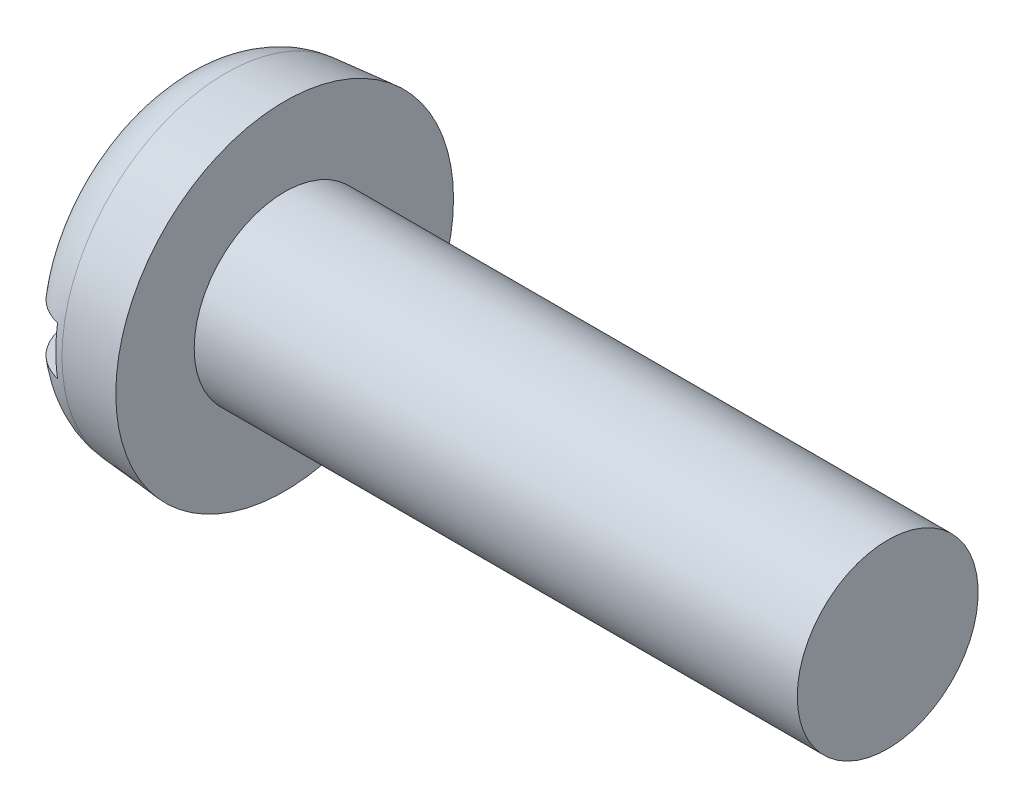
ISO-10303-21;
HEADER;
FILE_DESCRIPTION(('STEP AP214'),'2;1');
FILE_NAME('part.step','',(''),(''),'','','');
FILE_SCHEMA(('AUTOMOTIVE_DESIGN { 1 0 10303 214 1 1 1 1 }'));
ENDSEC;
DATA;
#1=APPLICATION_CONTEXT('core data for automotive mechanical design processes');
#2=APPLICATION_PROTOCOL_DEFINITION('international standard','automotive_design',2000,#1);
#3=PRODUCT_CONTEXT('',#1,'mechanical');
#4=PRODUCT('Part','Part','',(#3));
#5=PRODUCT_RELATED_PRODUCT_CATEGORY('part','',(#4));
#6=PRODUCT_DEFINITION_FORMATION('','',#4);
#7=PRODUCT_DEFINITION_CONTEXT('part definition',#1,'design');
#8=PRODUCT_DEFINITION('design','',#6,#7);
#9=PRODUCT_DEFINITION_SHAPE('','',#8);
#10=(LENGTH_UNIT() NAMED_UNIT(*) SI_UNIT(.MILLI.,.METRE.));
#11=(NAMED_UNIT(*) PLANE_ANGLE_UNIT() SI_UNIT($,.RADIAN.));
#12=(NAMED_UNIT(*) SI_UNIT($,.STERADIAN.) SOLID_ANGLE_UNIT());
#13=UNCERTAINTY_MEASURE_WITH_UNIT(LENGTH_MEASURE(1.E-05),#10,'distance_accuracy_value','');
#14=(GEOMETRIC_REPRESENTATION_CONTEXT(3) GLOBAL_UNCERTAINTY_ASSIGNED_CONTEXT((#13)) GLOBAL_UNIT_ASSIGNED_CONTEXT((#10,
#11,#12)) REPRESENTATION_CONTEXT('',''));
#15=CARTESIAN_POINT('',(0.,0.,0.));
#16=DIRECTION('',(0.,0.,1.));
#17=DIRECTION('',(1.,0.,0.));
#18=AXIS2_PLACEMENT_3D('',#15,#16,#17);
#19=CARTESIAN_POINT('',(0.,0.,0.));
#20=DIRECTION('',(-1.,0.,0.));
#21=DIRECTION('',(0.,0.,1.));
#22=AXIS2_PLACEMENT_3D('',#19,#20,#21);
#23=PLANE('',#22);
#24=DIRECTION('',(0.,0.,-1.));
#25=VECTOR('',#24,1.);
#26=CARTESIAN_POINT('',(0.,0.4,2.8));
#27=LINE('',#26,#25);
#28=CARTESIAN_POINT('',(0.,0.4,1.77326763142532));
#29=VERTEX_POINT('',#28);
#30=CARTESIAN_POINT('',(0.,0.4,-1.77326763142532));
#31=VERTEX_POINT('',#30);
#32=EDGE_CURVE('E87',#29,#31,#27,.T.);
#33=ORIENTED_EDGE('',*,*,#32,.F.);
#34=CARTESIAN_POINT('',(0.,0.,0.));
#35=DIRECTION('',(-1.,0.,0.));
#36=DIRECTION('',(0.,0.,1.));
#37=AXIS2_PLACEMENT_3D('',#34,#35,#36);
#38=CIRCLE('',#37,1.81782234903766);
#39=EDGE_CURVE('E93',#29,#31,#38,.T.);
#40=ORIENTED_EDGE('',*,*,#39,.T.);
#41=EDGE_LOOP('',(#33,#40));
#42=FACE_BOUND('',#41,.T.);
#43=ADVANCED_FACE('F34',(#42),#23,.T.);
#44=CARTESIAN_POINT('',(-25.4,0.,0.));
#45=DIRECTION('',(-1.,0.,0.));
#46=DIRECTION('',(0.,0.,1.));
#47=AXIS2_PLACEMENT_3D('',#44,#45,#46);
#48=CYLINDRICAL_SURFACE('',#47,1.5);
#49=CARTESIAN_POINT('',(11.8,0.,0.));
#50=DIRECTION('',(-1.,0.,0.));
#51=DIRECTION('',(0.,0.,1.));
#52=AXIS2_PLACEMENT_3D('',#49,#50,#51);
#53=CIRCLE('',#52,1.5);
#54=CARTESIAN_POINT('',(11.8,0.,1.5));
#55=VERTEX_POINT('',#54);
#56=EDGE_CURVE('E94',#55,#55,#53,.T.);
#57=ORIENTED_EDGE('',*,*,#56,.T.);
#58=EDGE_LOOP('',(#57));
#59=FACE_BOUND('',#58,.T.);
#60=CARTESIAN_POINT('',(1.8,0.,0.));
#61=DIRECTION('',(-1.,0.,0.));
#62=DIRECTION('',(0.,0.,1.));
#63=AXIS2_PLACEMENT_3D('',#60,#61,#62);
#64=CIRCLE('',#63,1.5);
#65=CARTESIAN_POINT('',(1.8,0.,1.5));
#66=VERTEX_POINT('',#65);
#67=EDGE_CURVE('E151',#66,#66,#64,.T.);
#68=ORIENTED_EDGE('',*,*,#67,.F.);
#69=EDGE_LOOP('',(#68));
#70=FACE_BOUND('',#69,.T.);
#71=ADVANCED_FACE('F139',(#59,#70),#48,.T.);
#72=CARTESIAN_POINT('',(11.8,1.5,0.));
#73=DIRECTION('',(1.,0.,0.));
#74=DIRECTION('',(0.,0.,-1.));
#75=AXIS2_PLACEMENT_3D('',#72,#73,#74);
#76=PLANE('',#75);
#77=ORIENTED_EDGE('',*,*,#56,.F.);
#78=EDGE_LOOP('',(#77));
#79=FACE_BOUND('',#78,.T.);
#80=ADVANCED_FACE('F137',(#79),#76,.T.);
#81=DIRECTION('',(0.,0.,1.));
#82=VECTOR('',#81,1.);
#83=CARTESIAN_POINT('',(0.,-0.4,-2.8));
#84=LINE('',#83,#82);
#85=CARTESIAN_POINT('',(0.,-0.4,-1.77326763142532));
#86=VERTEX_POINT('',#85);
#87=CARTESIAN_POINT('',(0.,-0.4,1.77326763142532));
#88=VERTEX_POINT('',#87);
#89=EDGE_CURVE('E78',#86,#88,#84,.T.);
#90=ORIENTED_EDGE('',*,*,#89,.F.);
#91=EDGE_CURVE('E85',#86,#88,#38,.T.);
#92=ORIENTED_EDGE('',*,*,#91,.T.);
#93=EDGE_LOOP('',(#90,#92));
#94=FACE_BOUND('',#93,.T.);
#95=ADVANCED_FACE('F84',(#94),#23,.T.);
#96=CARTESIAN_POINT('',(0.,0.,0.));
#97=DIRECTION('',(1.,0.,0.));
#98=DIRECTION('',(0.,0.,-1.));
#99=AXIS2_PLACEMENT_3D('',#96,#97,#98);
#100=CONICAL_SURFACE('',#99,2.64252040565334,0.0872664625997168);
#101=CARTESIAN_POINT('',(0.821559831527111,0.,0.));
#102=DIRECTION('',(-1.,0.,0.));
#103=DIRECTION('',(0.,0.,1.));
#104=AXIS2_PLACEMENT_3D('',#101,#102,#103);
#105=CIRCLE('',#104,2.71439757732023);
#106=CARTESIAN_POINT('',(0.821559831527111,0.,2.71439757732023));
#107=VERTEX_POINT('',#106);
#108=EDGE_CURVE('E97',#107,#107,#105,.F.);
#109=ORIENTED_EDGE('',*,*,#108,.T.);
#110=EDGE_LOOP('',(#109));
#111=FACE_BOUND('',#110,.T.);
#112=CARTESIAN_POINT('',(1.8,0.,0.));
#113=DIRECTION('',(-1.,0.,0.));
#114=DIRECTION('',(0.,0.,1.));
#115=AXIS2_PLACEMENT_3D('',#112,#113,#114);
#116=CIRCLE('',#115,2.8);
#117=CARTESIAN_POINT('',(1.8,0.,2.8));
#118=VERTEX_POINT('',#117);
#119=EDGE_CURVE('E99',#118,#118,#116,.T.);
#120=ORIENTED_EDGE('',*,*,#119,.T.);
#121=EDGE_LOOP('',(#120));
#122=FACE_BOUND('',#121,.T.);
#123=ADVANCED_FACE('F130',(#111,#122),#100,.T.);
#124=CARTESIAN_POINT('',(1.8,1.5,0.));
#125=DIRECTION('',(-1.,0.,0.));
#126=DIRECTION('',(0.,0.,1.));
#127=AXIS2_PLACEMENT_3D('',#124,#125,#126);
#128=PLANE('',#127);
#129=ORIENTED_EDGE('',*,*,#119,.F.);
#130=EDGE_LOOP('',(#129));
#131=FACE_BOUND('',#130,.T.);
#132=ORIENTED_EDGE('',*,*,#67,.T.);
#133=EDGE_LOOP('',(#132));
#134=FACE_BOUND('',#133,.T.);
#135=ADVANCED_FACE('F126',(#131,#134),#128,.F.);
#136=CARTESIAN_POINT('',(0.9,0.,0.));
#137=DIRECTION('',(-1.,0.,0.));
#138=DIRECTION('',(0.,0.,1.));
#139=AXIS2_PLACEMENT_3D('',#136,#137,#138);
#140=TOROIDAL_SURFACE('',#139,1.81782234903766,0.9);
#141=CARTESIAN_POINT('',(0.401696093511728,0.4,-2.53593152114129));
#142=CARTESIAN_POINT('',(0.443301117774009,0.4,-2.56393332788218));
#143=CARTESIAN_POINT('',(0.48728921147468,0.4,-2.58845843023252));
#144=CARTESIAN_POINT('',(0.578792425576941,0.4,-2.62980192456992));
#145=CARTESIAN_POINT('',(0.626311517541325,0.4,-2.64661148109401));
#146=CARTESIAN_POINT('',(0.723491694345221,0.4,-2.67199528317045));
#147=CARTESIAN_POINT('',(0.77315217005018,0.4,-2.6805718547261));
#148=CARTESIAN_POINT('',(0.873195470603058,0.4,-2.68923740018578));
#149=CARTESIAN_POINT('',(0.923578118909892,0.4,-2.68932841422142));
#150=CARTESIAN_POINT('',(1.02350797374872,0.4,-2.68103738118982));
#151=CARTESIAN_POINT('',(1.07305702227845,0.4,-2.67267751789981));
#152=CARTESIAN_POINT('',(1.17005159771854,0.4,-2.64776531442094));
#153=CARTESIAN_POINT('',(1.21749706154432,0.4,-2.63121272872072));
#154=CARTESIAN_POINT('',(1.30899463227735,0.4,-2.59038229907007));
#155=CARTESIAN_POINT('',(1.35304326494453,0.4,-2.5660966726896));
#156=CARTESIAN_POINT('',(1.43646971838795,0.4,-2.51051742624853));
#157=CARTESIAN_POINT('',(1.47584746170715,0.4,-2.47922368999777));
#158=CARTESIAN_POINT('',(1.54908472891299,0.4,-2.41032419236434));
#159=CARTESIAN_POINT('',(1.58290894495081,0.4,-2.37268091273685));
#160=CARTESIAN_POINT('',(1.64384285536696,0.4,-2.29230689336045));
#161=CARTESIAN_POINT('',(1.67095227126419,0.4,-2.24957594272072));
#162=CARTESIAN_POINT('',(1.71804431058735,0.4,-2.15971237578418));
#163=CARTESIAN_POINT('',(1.73793948776457,0.4,-2.11253395536871));
#164=CARTESIAN_POINT('',(1.76968090770725,0.4,-2.01554593245493));
#165=CARTESIAN_POINT('',(1.78152655521718,0.4,-1.96573613566218));
#166=CARTESIAN_POINT('',(1.79707863209083,0.4,-1.86394560462762));
#167=CARTESIAN_POINT('',(1.80063474217523,0.4,-1.81194193297292));
#168=CARTESIAN_POINT('',(1.79917918253395,0.4,-1.70805700113295));
#169=CARTESIAN_POINT('',(1.79416652473772,0.4,-1.65617575575555));
#170=CARTESIAN_POINT('',(1.7755943642346,0.4,-1.55269446133053));
#171=CARTESIAN_POINT('',(1.76183474132893,0.4,-1.50113034177219));
#172=CARTESIAN_POINT('',(1.72605722331735,0.4,-1.40095096381718));
#173=CARTESIAN_POINT('',(1.70403814128862,0.4,-1.35233613041373));
#174=CARTESIAN_POINT('',(1.65177086981811,0.4,-1.25824022538735));
#175=CARTESIAN_POINT('',(1.62134113345016,0.4,-1.21285988807693));
#176=CARTESIAN_POINT('',(1.55331109595649,0.4,-1.12780932458797));
#177=CARTESIAN_POINT('',(1.51570875984687,0.4,-1.08814072454133));
#178=CARTESIAN_POINT('',(1.43418773757712,0.4,-1.01571120097083));
#179=CARTESIAN_POINT('',(1.39025557046043,0.4,-0.982965398150426));
#180=CARTESIAN_POINT('',(1.29725173640542,0.4,-0.925820211344956));
#181=CARTESIAN_POINT('',(1.24818246394632,0.4,-0.901416961201436));
#182=CARTESIAN_POINT('',(1.1492196326343,0.4,-0.863395366502829));
#183=CARTESIAN_POINT('',(1.09953332116632,0.4,-0.849240526280142));
#184=CARTESIAN_POINT('',(0.998407326739823,0.4,-0.830450847570662));
#185=CARTESIAN_POINT('',(0.946969290105793,0.4,-0.825807308120568));
#186=CARTESIAN_POINT('',(0.84892872096548,0.4,-0.826338661096803));
#187=CARTESIAN_POINT('',(0.802319233875119,0.4,-0.830644672645143));
#188=CARTESIAN_POINT('',(0.710503550748047,0.4,-0.847082675101284));
#189=CARTESIAN_POINT('',(0.665297586491216,0.4,-0.859215951485934));
#190=CARTESIAN_POINT('',(0.577725921687515,0.4,-0.890561229701253));
#191=CARTESIAN_POINT('',(0.535345451357801,0.4,-0.909732336345551));
#192=CARTESIAN_POINT('',(0.454039585142496,0.4,-0.954356114786257));
#193=CARTESIAN_POINT('',(0.415115190169609,0.4,-0.979810598293163));
#194=CARTESIAN_POINT('',(0.338258283652574,0.4,-1.03863563377017));
#195=CARTESIAN_POINT('',(0.300704584388947,0.4,-1.07250127234658));
#196=CARTESIAN_POINT('',(0.231340396591253,0.4,-1.14567873524743));
#197=CARTESIAN_POINT('',(0.199531837361427,0.4,-1.1849923812911));
#198=CARTESIAN_POINT('',(0.140343537062657,0.4,-1.27100479329441));
#199=CARTESIAN_POINT('',(0.113435239263175,0.4,-1.31802904125808));
#200=CARTESIAN_POINT('',(0.0677697881199934,0.4,-1.41588613859262));
#201=CARTESIAN_POINT('',(0.0490135480549559,0.4,-1.466719413943));
#202=CARTESIAN_POINT('',(0.0200605085740848,0.4,-1.57150752749652));
#203=CARTESIAN_POINT('',(0.00998112078324489,0.4,-1.62549494001755));
#204=CARTESIAN_POINT('',(-0.000774459474645484,0.4,-1.73439964710515));
#205=CARTESIAN_POINT('',(-0.00145178031293717,0.4,-1.78931682929512));
#206=CARTESIAN_POINT('',(0.00665978805998371,0.4,-1.8973585349181));
#207=CARTESIAN_POINT('',(0.0152619165789972,0.4,-1.95049703954292));
#208=CARTESIAN_POINT('',(0.0415044362784365,0.4,-2.05451158025993));
#209=CARTESIAN_POINT('',(0.0591459771853456,0.4,-2.10538732765632));
#210=CARTESIAN_POINT('',(0.102479617855353,0.4,-2.20207106255329));
#211=CARTESIAN_POINT('',(0.127962009730159,0.4,-2.24797321246302));
#212=CARTESIAN_POINT('',(0.186405952526769,0.4,-2.3346826673761));
#213=CARTESIAN_POINT('',(0.219357119954585,0.4,-2.37549692488183));
#214=CARTESIAN_POINT('',(0.2776517991716,0.4,-2.43611780517026));
#215=CARTESIAN_POINT('',(0.300961246504243,0.4,-2.45791602542563));
#216=CARTESIAN_POINT('',(0.349758108963351,0.4,-2.49892172941219));
#217=CARTESIAN_POINT('',(0.375245501851939,0.4,-2.51812923959063));
#218=CARTESIAN_POINT('',(0.401696093511728,0.4,-2.53593152114129));
#219=B_SPLINE_CURVE_WITH_KNOTS('',3,(#141,#142,#143,#144,#145,#146,#147,#148,#149,#150,#151,
#152,#153,#154,#155,#156,#157,#158,#159,#160,#161,#162,#163,#164,#165,#166,#167,#168,#169,#170,
#171,#172,#173,#174,#175,#176,#177,#178,#179,#180,#181,#182,#183,#184,#185,#186,#187,#188,#189,
#190,#191,#192,#193,#194,#195,#196,#197,#198,#199,#200,#201,#202,#203,#204,#205,#206,#207,#208,
#209,#210,#211,#212,#213,#214,#215,#216,#217,#218),.UNSPECIFIED.,.T.,.F.,(4,2,2,2,2,2,2,2,2,2,2,
2,2,2,2,2,2,2,2,2,2,2,2,2,2,2,2,2,2,2,2,2,2,2,2,2,2,2,4),(0.,0.150335933494514,
0.300843597394242,0.451308726970357,0.601737681026104,0.751772777865598,0.901812371080131,
1.05200344195132,1.20219700308282,1.35331128753966,1.50443183806961,1.65732734739064,
1.81023416196794,1.96589285940572,2.1215695071664,2.28094272743601,2.44033885916066,
2.60348795607714,2.76668341009569,2.93023171311279,3.09370412047096,3.24783730341248,
3.40182942181944,3.5415702699926,3.68133407374162,3.82029827564248,3.95930259253055,
4.11036263383425,4.26147330942957,4.42325618279747,4.58505717610391,4.74901464634026,
4.9129524393615,5.07365129317271,5.23437059141101,5.39111839087745,5.54764959339694,
5.64322735248863,5.73880413580184),.UNSPECIFIED.);
#220=CARTESIAN_POINT('',(0.7,0.4,-2.66547244738019));
#221=VERTEX_POINT('',#220);
#222=EDGE_CURVE('E11',#31,#221,#219,.T.);
#223=ORIENTED_EDGE('',*,*,#222,.F.);
#224=ORIENTED_EDGE('',*,*,#39,.F.);
#225=CARTESIAN_POINT('',(0.631175220468883,0.4,0.871495981540627));
#226=CARTESIAN_POINT('',(0.674904543341188,0.4,0.856438796500031));
#227=CARTESIAN_POINT('',(0.719878263159747,0.4,0.844929838444239));
#228=CARTESIAN_POINT('',(0.811135722097473,0.4,0.829645582358335));
#229=CARTESIAN_POINT('',(0.857419653490011,0.4,0.82587142543657));
#230=CARTESIAN_POINT('',(0.949967657712768,0.4,0.826292946243278));
#231=CARTESIAN_POINT('',(0.996231718998188,0.4,0.830491246695725));
#232=CARTESIAN_POINT('',(1.08739120729822,0.4,0.846603737630664));
#233=CARTESIAN_POINT('',(1.13228633060722,0.4,0.858519627443414));
#234=CARTESIAN_POINT('',(1.21961165117638,0.4,0.889449471124122));
#235=CARTESIAN_POINT('',(1.26203829733493,0.4,0.908473372222466));
#236=CARTESIAN_POINT('',(1.34345634110222,0.4,0.952815473313927));
#237=CARTESIAN_POINT('',(1.38244667242382,0.4,0.978135617780085));
#238=CARTESIAN_POINT('',(1.4594377621541,0.4,1.03667706350997));
#239=CARTESIAN_POINT('',(1.49706398720202,0.4,1.07039108297028));
#240=CARTESIAN_POINT('',(1.56659895295035,0.4,1.14327535241885));
#241=CARTESIAN_POINT('',(1.59850581805068,0.4,1.18244738484377));
#242=CARTESIAN_POINT('',(1.65794109406934,0.4,1.26820361081833));
#243=CARTESIAN_POINT('',(1.68499616118368,0.4,1.31511693869777));
#244=CARTESIAN_POINT('',(1.73097615311023,0.4,1.41277630231542));
#245=CARTESIAN_POINT('',(1.74990014079754,0.4,1.46352277904048));
#246=CARTESIAN_POINT('',(1.77921631303595,0.4,1.56819037296415));
#247=CARTESIAN_POINT('',(1.78948692404479,0.4,1.62214568122431));
#248=CARTESIAN_POINT('',(1.80062989577949,0.4,1.73102148257415));
#249=CARTESIAN_POINT('',(1.80150300404476,0.4,1.78594189854469));
#250=CARTESIAN_POINT('',(1.79377570144154,0.4,1.89403950300678));
#251=CARTESIAN_POINT('',(1.78535947623962,0.4,1.94722981003804));
#252=CARTESIAN_POINT('',(1.75948035152466,0.4,2.05136420293336));
#253=CARTESIAN_POINT('',(1.74201866082191,0.4,2.10230858794919));
#254=CARTESIAN_POINT('',(1.69903294428936,0.4,2.1991365537311));
#255=CARTESIAN_POINT('',(1.67372338322898,0.4,2.24511537218269));
#256=CARTESIAN_POINT('',(1.61559302758182,0.4,2.33205182310155));
#257=CARTESIAN_POINT('',(1.58277310246186,0.4,2.37301003595672));
#258=CARTESIAN_POINT('',(1.51127974813898,0.4,2.44787841079591));
#259=CARTESIAN_POINT('',(1.47273752290481,0.4,2.48191390856888));
#260=CARTESIAN_POINT('',(1.39041996071933,0.4,2.54292499319193));
#261=CARTESIAN_POINT('',(1.34664504043414,0.4,2.5699011416151));
#262=CARTESIAN_POINT('',(1.25574182443869,0.4,2.61566191750627));
#263=CARTESIAN_POINT('',(1.20866632391598,0.4,2.63455146707593));
#264=CARTESIAN_POINT('',(1.11199802813735,0.4,2.66409285611721));
#265=CARTESIAN_POINT('',(1.06240535215686,0.4,2.67474508552361));
#266=CARTESIAN_POINT('',(0.962502526653357,0.4,2.68744471269732));
#267=CARTESIAN_POINT('',(0.912200346253432,0.4,2.68955487726819));
#268=CARTESIAN_POINT('',(0.811958811975336,0.4,2.68528081529453));
#269=CARTESIAN_POINT('',(0.762019450666034,0.4,2.67889676322146));
#270=CARTESIAN_POINT('',(0.664027531989639,0.4,2.65784627208927));
#271=CARTESIAN_POINT('',(0.615971279375599,0.4,2.643197022474));
#272=CARTESIAN_POINT('',(0.522990210676872,0.4,2.60606123058607));
#273=CARTESIAN_POINT('',(0.478065406672589,0.4,2.58357465808084));
#274=CARTESIAN_POINT('',(0.392472109536808,0.4,2.53134616302211));
#275=CARTESIAN_POINT('',(0.351816515703728,0.4,2.50158310815031));
#276=CARTESIAN_POINT('',(0.276029509997113,0.4,2.4357048513604));
#277=CARTESIAN_POINT('',(0.240898244430083,0.4,2.39958948126101));
#278=CARTESIAN_POINT('',(0.176835333350468,0.4,2.32172709740984));
#279=CARTESIAN_POINT('',(0.147956836829552,0.4,2.27993636985612));
#280=CARTESIAN_POINT('',(0.0975151321071609,0.4,2.19215427977415));
#281=CARTESIAN_POINT('',(0.0759523258739369,0.4,2.14616268660111));
#282=CARTESIAN_POINT('',(0.0404117526562702,0.4,2.05060031814039));
#283=CARTESIAN_POINT('',(0.0265449840419457,0.4,2.00098828619734));
#284=CARTESIAN_POINT('',(0.00715737687929584,0.4,1.90016214005584));
#285=CARTESIAN_POINT('',(0.00163730520276083,0.4,1.84894787909014));
#286=CARTESIAN_POINT('',(-0.00103646856464831,0.4,1.74525626284435));
#287=CARTESIAN_POINT('',(0.00198298502720431,0.4,1.692774471539));
#288=CARTESIAN_POINT('',(0.0165672576861163,0.4,1.5890162459782));
#289=CARTESIAN_POINT('',(0.0281327748436754,0.4,1.53773991054426));
#290=CARTESIAN_POINT('',(0.0597928723844844,0.4,1.43649219995258));
#291=CARTESIAN_POINT('',(0.0800919231210289,0.4,1.3865847552086));
#292=CARTESIAN_POINT('',(0.128628670781471,0.4,1.29076759544655));
#293=CARTESIAN_POINT('',(0.156870001205797,0.4,1.2448597228063));
#294=CARTESIAN_POINT('',(0.221149361739103,0.4,1.15746425330815));
#295=CARTESIAN_POINT('',(0.257329693538453,0.4,1.11608124200677));
#296=CARTESIAN_POINT('',(0.33619903186313,0.4,1.04011285475969));
#297=CARTESIAN_POINT('',(0.378880772489415,0.4,1.00551998779309));
#298=CARTESIAN_POINT('',(0.456345744826249,0.4,0.953377181098868));
#299=CARTESIAN_POINT('',(0.489781510585734,0.4,0.933802963989649));
#300=CARTESIAN_POINT('',(0.558913558209207,0.4,0.899158166013482));
#301=CARTESIAN_POINT('',(0.594609343085406,0.4,0.884086599134742));
#302=CARTESIAN_POINT('',(0.631175220468883,0.4,0.871495981540627));
#303=B_SPLINE_CURVE_WITH_KNOTS('',3,(#225,#226,#227,#228,#229,#230,#231,#232,#233,#234,#235,
#236,#237,#238,#239,#240,#241,#242,#243,#244,#245,#246,#247,#248,#249,#250,#251,#252,#253,#254,
#255,#256,#257,#258,#259,#260,#261,#262,#263,#264,#265,#266,#267,#268,#269,#270,#271,#272,#273,
#274,#275,#276,#277,#278,#279,#280,#281,#282,#283,#284,#285,#286,#287,#288,#289,#290,#291,#292,
#293,#294,#295,#296,#297,#298,#299,#300,#301,#302),.UNSPECIFIED.,.T.,.F.,(4,2,2,2,2,2,2,2,2,2,2,
2,2,2,2,2,2,2,2,2,2,2,2,2,2,2,2,2,2,2,2,2,2,2,2,2,2,2,4),(0.,0.138615612916103,
0.277251674198893,0.415933350916858,0.554645574236207,0.693552648422647,0.832502674767945,
0.983421485118331,1.13438969741741,1.29610427307938,1.45783748170807,1.62180673071881,
1.78576293643649,1.94652574714201,2.10726707950299,2.2639540446038,2.42062287939072,
2.57413636036031,2.72763762557716,2.87908198292273,3.03051917082038,3.18084156107108,
3.33116086374289,3.4811686879926,3.63117709090574,3.78162643331956,3.93207975956823,
4.08376569017546,4.23545995397545,4.38928870771081,4.54313159395465,4.70011617891189,
4.85711358867004,5.01800577434983,5.17897168640495,5.34310060642745,5.50704742574204,
5.62298136153755,5.73888989092701),.UNSPECIFIED.);
#304=CARTESIAN_POINT('',(0.7,0.4,2.66547244738019));
#305=VERTEX_POINT('',#304);
#306=EDGE_CURVE('E111',#305,#29,#303,.T.);
#307=ORIENTED_EDGE('',*,*,#306,.F.);
#308=CARTESIAN_POINT('',(0.7,0.,0.));
#309=DIRECTION('',(-1.,0.,0.));
#310=DIRECTION('',(0.,0.,1.));
#311=AXIS2_PLACEMENT_3D('',#308,#309,#310);
#312=CIRCLE('',#311,2.69531878777687);
#313=CARTESIAN_POINT('',(0.7,-0.4,2.66547244738019));
#314=VERTEX_POINT('',#313);
#315=EDGE_CURVE('E105',#305,#314,#312,.F.);
#316=ORIENTED_EDGE('',*,*,#315,.T.);
#317=CARTESIAN_POINT('',(0.631175220468883,-0.4,0.871495981540627));
#318=CARTESIAN_POINT('',(0.582440056051627,-0.4,0.888281741940888));
#319=CARTESIAN_POINT('',(0.535174963055644,-0.4,0.909503716497946));
#320=CARTESIAN_POINT('',(0.444903467512748,-0.4,0.959728629210835));
#321=CARTESIAN_POINT('',(0.401907569369314,-0.4,0.988750138784298));
#322=CARTESIAN_POINT('',(0.32139933187422,-0.4,1.05330679583531));
#323=CARTESIAN_POINT('',(0.283866824101226,-0.4,1.08881683540862));
#324=CARTESIAN_POINT('',(0.214947035166147,-0.4,1.16532583126717));
#325=CARTESIAN_POINT('',(0.183557026279774,-0.4,1.20632233747312));
#326=CARTESIAN_POINT('',(0.126173306630207,-0.4,1.29499806178717));
#327=CARTESIAN_POINT('',(0.100543812186154,-0.4,1.34291357063032));
#328=CARTESIAN_POINT('',(0.0575990442880277,-0.4,1.44234685085245));
#329=CARTESIAN_POINT('',(0.0402853165841816,-0.4,1.4938652899135));
#330=CARTESIAN_POINT('',(0.0144295468099868,-0.4,1.59957722380881));
#331=CARTESIAN_POINT('',(0.00597091020770669,-0.4,1.65379120331088));
#332=CARTESIAN_POINT('',(-0.00151505119498231,-0.4,1.76286943896087));
#333=CARTESIAN_POINT('',(-0.000543260661566268,-0.4,1.81773363362998));
#334=CARTESIAN_POINT('',(0.0108063117868816,-0.4,1.92531903415647));
#335=CARTESIAN_POINT('',(0.0209864254781905,-0.4,1.97806105250491));
#336=CARTESIAN_POINT('',(0.0502872770681116,-0.4,2.08100191154855));
#337=CARTESIAN_POINT('',(0.0694067748926924,-0.4,2.13120110391516));
#338=CARTESIAN_POINT('',(0.115513806824551,-0.4,2.22629801812597));
#339=CARTESIAN_POINT('',(0.14229288611334,-0.4,2.27129684027619));
#340=CARTESIAN_POINT('',(0.203167661896693,-0.4,2.35603997582291));
#341=CARTESIAN_POINT('',(0.237262555060448,-0.4,2.39578486536653));
#342=CARTESIAN_POINT('',(0.31107215015185,-0.4,2.46808210682477));
#343=CARTESIAN_POINT('',(0.350664393955093,-0.4,2.50075952492731));
#344=CARTESIAN_POINT('',(0.43483240572609,-0.4,2.55890052234819));
#345=CARTESIAN_POINT('',(0.479407789016665,-0.4,2.5843646579657));
#346=CARTESIAN_POINT('',(0.571659032279254,-0.4,2.62702917155574));
#347=CARTESIAN_POINT('',(0.61928802255602,-0.4,2.64433093880064));
#348=CARTESIAN_POINT('',(0.716785744822632,-0.4,2.67063086398603));
#349=CARTESIAN_POINT('',(0.766654377625563,-0.4,2.67962938927216));
#350=CARTESIAN_POINT('',(0.866851086765478,-0.4,2.68902063968356));
#351=CARTESIAN_POINT('',(0.917173710289189,-0.4,2.68947163706794));
#352=CARTESIAN_POINT('',(1.01717730229027,-0.4,2.68190382365889));
#353=CARTESIAN_POINT('',(1.06685828235616,-0.4,2.67388516605054));
#354=CARTESIAN_POINT('',(1.16408913364714,-0.4,2.64963561785688));
#355=CARTESIAN_POINT('',(1.21164224901621,-0.4,2.63341772685543));
#356=CARTESIAN_POINT('',(1.30336357324319,-0.4,2.5932548985632));
#357=CARTESIAN_POINT('',(1.34753176252252,-0.4,2.56930991658271));
#358=CARTESIAN_POINT('',(1.43140121230963,-0.4,2.51429882511239));
#359=CARTESIAN_POINT('',(1.47108662202344,-0.4,2.48320855787322));
#360=CARTESIAN_POINT('',(1.54472936336671,-0.4,2.41485918396244));
#361=CARTESIAN_POINT('',(1.57868652408327,-0.4,2.37759989329229));
#362=CARTESIAN_POINT('',(1.64024044205203,-0.4,2.29763356977095));
#363=CARTESIAN_POINT('',(1.66777905671271,-0.4,2.2548817982485));
#364=CARTESIAN_POINT('',(1.71540533966796,-0.4,2.16541487025925));
#365=CARTESIAN_POINT('',(1.73549258796614,-0.4,2.11869949056591));
#366=CARTESIAN_POINT('',(1.76797944190081,-0.4,2.02190542768205));
#367=CARTESIAN_POINT('',(1.78026184844694,-0.4,1.97178743470805));
#368=CARTESIAN_POINT('',(1.79642443017794,-0.4,1.87021727726405));
#369=CARTESIAN_POINT('',(1.80030382576996,-0.4,1.81876498945237));
#370=CARTESIAN_POINT('',(1.79965225810416,-0.4,1.71483495243173));
#371=CARTESIAN_POINT('',(1.79494304519989,-0.4,1.66235834857244));
#372=CARTESIAN_POINT('',(1.77700429154566,-0.4,1.55888409709202));
#373=CARTESIAN_POINT('',(1.76377367047763,-0.4,1.50788663784912));
#374=CARTESIAN_POINT('',(1.72880303252309,-0.4,1.40746214507163));
#375=CARTESIAN_POINT('',(1.7068583172022,-0.4,1.35810636780321));
#376=CARTESIAN_POINT('',(1.6551362081094,-0.4,1.2636760290119));
#377=CARTESIAN_POINT('',(1.62535713115486,-0.4,1.21860239032601));
#378=CARTESIAN_POINT('',(1.55817582249343,-0.4,1.13325277423327));
#379=CARTESIAN_POINT('',(1.52065002148733,-0.4,1.09307386688499));
#380=CARTESIAN_POINT('',(1.43925099604233,-0.4,1.01972901550195));
#381=CARTESIAN_POINT('',(1.39537733695676,-0.4,0.986563552070545));
#382=CARTESIAN_POINT('',(1.30343025383384,-0.4,0.929222350042134));
#383=CARTESIAN_POINT('',(1.25547156560025,-0.4,0.904863533629853));
#384=CARTESIAN_POINT('',(1.15587516450286,-0.4,0.865408006374134));
#385=CARTESIAN_POINT('',(1.10423998181313,-0.4,0.850304993129927));
#386=CARTESIAN_POINT('',(1.00351728354306,-0.4,0.831235729727251));
#387=CARTESIAN_POINT('',(0.954588162116058,-0.4,0.826429393731615));
#388=CARTESIAN_POINT('',(0.856720563885967,-0.4,0.825757597618513));
#389=CARTESIAN_POINT('',(0.80778225521716,-0.4,0.8298764112406));
#390=CARTESIAN_POINT('',(0.737839755845568,-0.4,0.842103164129609));
#391=CARTESIAN_POINT('',(0.716186869313665,-0.4,0.846800488735406));
#392=CARTESIAN_POINT('',(0.673323995455611,-0.4,0.857891117601622));
#393=CARTESIAN_POINT('',(0.652113925657395,-0.4,0.86428410295996));
#394=CARTESIAN_POINT('',(0.631175220468883,-0.4,0.871495981540627));
#395=B_SPLINE_CURVE_WITH_KNOTS('',3,(#317,#318,#319,#320,#321,#322,#323,#324,#325,#326,#327,
#328,#329,#330,#331,#332,#333,#334,#335,#336,#337,#338,#339,#340,#341,#342,#343,#344,#345,#346,
#347,#348,#349,#350,#351,#352,#353,#354,#355,#356,#357,#358,#359,#360,#361,#362,#363,#364,#365,
#366,#367,#368,#369,#370,#371,#372,#373,#374,#375,#376,#377,#378,#379,#380,#381,#382,#383,#384,
#385,#386,#387,#388,#389,#390,#391,#392,#393,#394),.UNSPECIFIED.,.T.,.F.,(4,2,2,2,2,2,2,2,2,2,2,
2,2,2,2,2,2,2,2,2,2,2,2,2,2,2,2,2,2,2,2,2,2,2,2,2,2,2,4),(0.,0.154545929505514,
0.309463158544145,0.463793151236126,0.618054453677577,0.780314715588444,0.942605127077751,
1.10641075199289,1.27020101048904,1.43055663497239,1.59089002147255,1.74721863073234,
1.90353008272413,2.05679554725431,2.2100491885017,2.3613455070347,2.51263513171131,
2.66289297461213,2.81314809994484,2.96316574487772,3.11318425745476,3.26371763526343,
3.41425550371989,3.56610818035137,3.71796941486144,3.87206025933959,4.02616539904814,
4.18350533199931,4.3408652159535,4.50216376271748,4.66349699219782,4.82763600715278,
4.99178626625811,5.15229563882414,5.31269559661531,5.45941323508264,5.6058725648985,
5.67228456882568,5.73868409152545),.UNSPECIFIED.);
#396=EDGE_CURVE('E92',#88,#314,#395,.T.);
#397=ORIENTED_EDGE('',*,*,#396,.F.);
#398=ORIENTED_EDGE('',*,*,#91,.F.);
#399=CARTESIAN_POINT('',(0.401696093511728,-0.4,-2.53593152114129));
#400=CARTESIAN_POINT('',(0.359499569861718,-0.4,-2.50752594853869));
#401=CARTESIAN_POINT('',(0.319690458635452,-0.4,-2.47549983982046));
#402=CARTESIAN_POINT('',(0.246006645656666,-0.4,-2.40516587836491));
#403=CARTESIAN_POINT('',(0.212140132740978,-0.4,-2.36684949616946));
#404=CARTESIAN_POINT('',(0.151336229791143,-0.4,-2.28512812362888));
#405=CARTESIAN_POINT('',(0.124391330893495,-0.4,-2.24172872264131));
#406=CARTESIAN_POINT('',(0.0780875903765085,-0.4,-2.15107708021563));
#407=CARTESIAN_POINT('',(0.0587267801703001,-0.4,-2.10382584244335));
#408=CARTESIAN_POINT('',(0.0278574989581019,-0.4,-2.00623443962711));
#409=CARTESIAN_POINT('',(0.016440901453291,-0.4,-1.95586524023863));
#410=CARTESIAN_POINT('',(0.00203581031766626,-0.4,-1.85393618870856));
#411=CARTESIAN_POINT('',(-0.000951523403916868,-0.4,-1.80237617368877));
#412=CARTESIAN_POINT('',(0.00150541182221353,-0.4,-1.69835894015113));
#413=CARTESIAN_POINT('',(0.00713078743956859,-0.4,-1.64590602749594));
#414=CARTESIAN_POINT('',(0.0268851706508874,-0.4,-1.54262865024755));
#415=CARTESIAN_POINT('',(0.0410152341853257,-0.4,-1.49180438869281));
#416=CARTESIAN_POINT('',(0.0777693985439923,-0.4,-1.39187524119994));
#417=CARTESIAN_POINT('',(0.100597428420281,-0.4,-1.34284532896703));
#418=CARTESIAN_POINT('',(0.154028665500749,-0.4,-1.24921236961778));
#419=CARTESIAN_POINT('',(0.184633577370676,-0.4,-1.20461029605316));
#420=CARTESIAN_POINT('',(0.253369835088766,-0.4,-1.12040413132917));
#421=CARTESIAN_POINT('',(0.291615661801268,-0.4,-1.08089328983157));
#422=CARTESIAN_POINT('',(0.374350758887981,-0.4,-1.00902344925026));
#423=CARTESIAN_POINT('',(0.418840522733276,-0.4,-0.976665015956932));
#424=CARTESIAN_POINT('',(0.511731904475918,-0.4,-0.921153761550259));
#425=CARTESIAN_POINT('',(0.56000602416032,-0.4,-0.897788688316841));
#426=CARTESIAN_POINT('',(0.660033558527157,-0.4,-0.860397113393027));
#427=CARTESIAN_POINT('',(0.711783369409339,-0.4,-0.846361098476873));
#428=CARTESIAN_POINT('',(0.812389224940536,-0.4,-0.829368295388297));
#429=CARTESIAN_POINT('',(0.861099258735353,-0.4,-0.825545352440831));
#430=CARTESIAN_POINT('',(0.958405899151309,-0.4,-0.826719597327248));
#431=CARTESIAN_POINT('',(1.00700253299767,-0.4,-0.831714388722303));
#432=CARTESIAN_POINT('',(1.0996760197852,-0.4,-0.84962330141339));
#433=CARTESIAN_POINT('',(1.14384950549969,-0.4,-0.862046867571478));
#434=CARTESIAN_POINT('',(1.22966211525765,-0.4,-0.89374221784771));
#435=CARTESIAN_POINT('',(1.27130051154861,-0.4,-0.913015957700824));
#436=CARTESIAN_POINT('',(1.35338723347829,-0.4,-0.958876506944367));
#437=CARTESIAN_POINT('',(1.39364158740159,-0.4,-0.985809526360112));
#438=CARTESIAN_POINT('',(1.46954671268381,-0.4,-1.04552244383327));
#439=CARTESIAN_POINT('',(1.50519595694897,-0.4,-1.07830427286891));
#440=CARTESIAN_POINT('',(1.5741481223088,-0.4,-1.15198864954587));
#441=CARTESIAN_POINT('',(1.60695638421133,-0.4,-1.19335517911256));
#442=CARTESIAN_POINT('',(1.66548530867698,-0.4,-1.28083525691765));
#443=CARTESIAN_POINT('',(1.69120428590284,-0.4,-1.32694993036066));
#444=CARTESIAN_POINT('',(1.73572700911521,-0.4,-1.42462801939109));
#445=CARTESIAN_POINT('',(1.75421770319601,-0.4,-1.47633466387386));
#446=CARTESIAN_POINT('',(1.78217546204147,-0.4,-1.58213636524115));
#447=CARTESIAN_POINT('',(1.79164262802123,-0.4,-1.63623139532851));
#448=CARTESIAN_POINT('',(1.80111834789599,-0.4,-1.74478524431538));
#449=CARTESIAN_POINT('',(1.80120671421375,-0.4,-1.79923704907971));
#450=CARTESIAN_POINT('',(1.79199564422116,-0.4,-1.90734333327446));
#451=CARTESIAN_POINT('',(1.78269735807886,-0.4,-1.96099790957378));
#452=CARTESIAN_POINT('',(1.75522804290983,-0.4,-2.06455754692508));
#453=CARTESIAN_POINT('',(1.73728348499548,-0.4,-2.11452267850709));
#454=CARTESIAN_POINT('',(1.69306568307316,-0.4,-2.21062233517153));
#455=CARTESIAN_POINT('',(1.66679349701772,-0.4,-2.25675734589841));
#456=CARTESIAN_POINT('',(1.60733395224623,-0.4,-2.34276585756036));
#457=CARTESIAN_POINT('',(1.57431956056638,-0.4,-2.38275897803032));
#458=CARTESIAN_POINT('',(1.50194333073533,-0.4,-2.45651788071981));
#459=CARTESIAN_POINT('',(1.46258208977932,-0.4,-2.49028424819412));
#460=CARTESIAN_POINT('',(1.37933549559489,-0.4,-2.55005790908044));
#461=CARTESIAN_POINT('',(1.33553510744259,-0.4,-2.57618357878773));
#462=CARTESIAN_POINT('',(1.24413819843943,-0.4,-2.62062313067504));
#463=CARTESIAN_POINT('',(1.19654207131845,-0.4,-2.63893782183569));
#464=CARTESIAN_POINT('',(1.09942378961358,-0.4,-2.66705979300267));
#465=CARTESIAN_POINT('',(1.0499260157382,-0.4,-2.67695133394454));
#466=CARTESIAN_POINT('',(0.949957006468675,-0.4,-2.68824503862299));
#467=CARTESIAN_POINT('',(0.899485546015457,-0.4,-2.6896452154879));
#468=CARTESIAN_POINT('',(0.799232995516733,-0.4,-2.68392343190627));
#469=CARTESIAN_POINT('',(0.749449974424365,-0.4,-2.67683486710842));
#470=CARTESIAN_POINT('',(0.651826495741724,-0.4,-2.65440372943721));
#471=CARTESIAN_POINT('',(0.603983614927445,-0.4,-2.63907181676455));
#472=CARTESIAN_POINT('',(0.530466612644572,-0.4,-2.60850240808469));
#473=CARTESIAN_POINT('',(0.503717386474933,-0.4,-2.59578274416443));
#474=CARTESIAN_POINT('',(0.45160806054978,-0.4,-2.56776112348693));
#475=CARTESIAN_POINT('',(0.426247954611343,-0.4,-2.55245917822458));
#476=CARTESIAN_POINT('',(0.401696093511728,-0.4,-2.53593152114129));
#477=B_SPLINE_CURVE_WITH_KNOTS('',3,(#399,#400,#401,#402,#403,#404,#405,#406,#407,#408,#409,
#410,#411,#412,#413,#414,#415,#416,#417,#418,#419,#420,#421,#422,#423,#424,#425,#426,#427,#428,
#429,#430,#431,#432,#433,#434,#435,#436,#437,#438,#439,#440,#441,#442,#443,#444,#445,#446,#447,
#448,#449,#450,#451,#452,#453,#454,#455,#456,#457,#458,#459,#460,#461,#462,#463,#464,#465,#466,
#467,#468,#469,#470,#471,#472,#473,#474,#475,#476),.UNSPECIFIED.,.T.,.F.,(4,2,2,2,2,2,2,2,2,2,2,
2,2,2,2,2,2,2,2,2,2,2,2,2,2,2,2,2,2,2,2,2,2,2,2,2,2,2,4),(0.,0.152490218607282,
0.305188944540641,0.457721310022948,0.610214056704589,0.764442291671228,0.91869174818651,
1.07622956938612,1.23378695448846,1.39529155818188,1.55683159371206,1.72100303477019,
1.88518745794618,2.0452166605768,2.2050824234249,2.3508822697905,2.49664249751799,
2.63370136587138,2.77079939621414,2.91549848817681,3.06024544108867,3.21793237831143,
3.37565677021802,3.539607260158,3.70355591107663,3.86610926645174,4.02864270620865,
4.18713298434998,4.34560313574806,4.5004280819907,4.65523846875457,4.80750509346896,
4.95975594414436,5.11046523737449,5.26120979331062,5.41136324663485,5.5613229886773,
5.65004914448151,5.73877490533682),.UNSPECIFIED.);
#478=CARTESIAN_POINT('',(0.7,-0.4,-2.66547244738019));
#479=VERTEX_POINT('',#478);
#480=EDGE_CURVE('E46',#479,#86,#477,.T.);
#481=ORIENTED_EDGE('',*,*,#480,.F.);
#482=EDGE_CURVE('E58',#479,#221,#312,.F.);
#483=ORIENTED_EDGE('',*,*,#482,.T.);
#484=EDGE_LOOP('',(#223,#224,#307,#316,#397,#398,#481,#483));
#485=FACE_BOUND('',#484,.T.);
#486=ORIENTED_EDGE('',*,*,#108,.F.);
#487=EDGE_LOOP('',(#486));
#488=FACE_BOUND('',#487,.T.);
#489=ADVANCED_FACE('F36',(#485,#488),#140,.T.);
#490=CARTESIAN_POINT('',(0.7,0.4,2.8));
#491=DIRECTION('',(0.,1.,0.));
#492=DIRECTION('',(0.,0.,1.));
#493=AXIS2_PLACEMENT_3D('',#490,#491,#492);
#494=PLANE('',#493);
#495=ORIENTED_EDGE('',*,*,#222,.T.);
#496=DIRECTION('',(0.,0.,-1.));
#497=VECTOR('',#496,1.);
#498=CARTESIAN_POINT('',(0.7,0.4,2.8));
#499=LINE('',#498,#497);
#500=EDGE_CURVE('E86',#305,#221,#499,.T.);
#501=ORIENTED_EDGE('',*,*,#500,.F.);
#502=ORIENTED_EDGE('',*,*,#306,.T.);
#503=ORIENTED_EDGE('',*,*,#32,.T.);
#504=EDGE_LOOP('',(#495,#501,#502,#503));
#505=FACE_BOUND('',#504,.T.);
#506=ADVANCED_FACE('F118',(#505),#494,.F.);
#507=CARTESIAN_POINT('',(0.7,-0.4,-2.8));
#508=DIRECTION('',(0.,-1.,0.));
#509=DIRECTION('',(0.,0.,-1.));
#510=AXIS2_PLACEMENT_3D('',#507,#508,#509);
#511=PLANE('',#510);
#512=ORIENTED_EDGE('',*,*,#480,.T.);
#513=ORIENTED_EDGE('',*,*,#89,.T.);
#514=ORIENTED_EDGE('',*,*,#396,.T.);
#515=DIRECTION('',(0.,0.,1.));
#516=VECTOR('',#515,1.);
#517=CARTESIAN_POINT('',(0.7,-0.4,-2.8));
#518=LINE('',#517,#516);
#519=EDGE_CURVE('E53',#479,#314,#518,.T.);
#520=ORIENTED_EDGE('',*,*,#519,.F.);
#521=EDGE_LOOP('',(#512,#513,#514,#520));
#522=FACE_BOUND('',#521,.T.);
#523=ADVANCED_FACE('F77',(#522),#511,.F.);
#524=CARTESIAN_POINT('',(0.7,0.4,-2.8));
#525=DIRECTION('',(-1.,0.,0.));
#526=DIRECTION('',(0.,0.,1.));
#527=AXIS2_PLACEMENT_3D('',#524,#525,#526);
#528=PLANE('',#527);
#529=ORIENTED_EDGE('',*,*,#519,.T.);
#530=ORIENTED_EDGE('',*,*,#315,.F.);
#531=ORIENTED_EDGE('',*,*,#500,.T.);
#532=ORIENTED_EDGE('',*,*,#482,.F.);
#533=EDGE_LOOP('',(#529,#530,#531,#532));
#534=FACE_BOUND('',#533,.T.);
#535=ADVANCED_FACE('F117',(#534),#528,.T.);
#536=CLOSED_SHELL('',(#43,#71,#80,#95,#123,#135,#489,#506,#523,#535));
#537=MANIFOLD_SOLID_BREP('B2',#536);
#538=ADVANCED_BREP_SHAPE_REPRESENTATION('',(#18,#537),#14);
#539=SHAPE_DEFINITION_REPRESENTATION(#9,#538);
ENDSEC;
END-ISO-10303-21;
